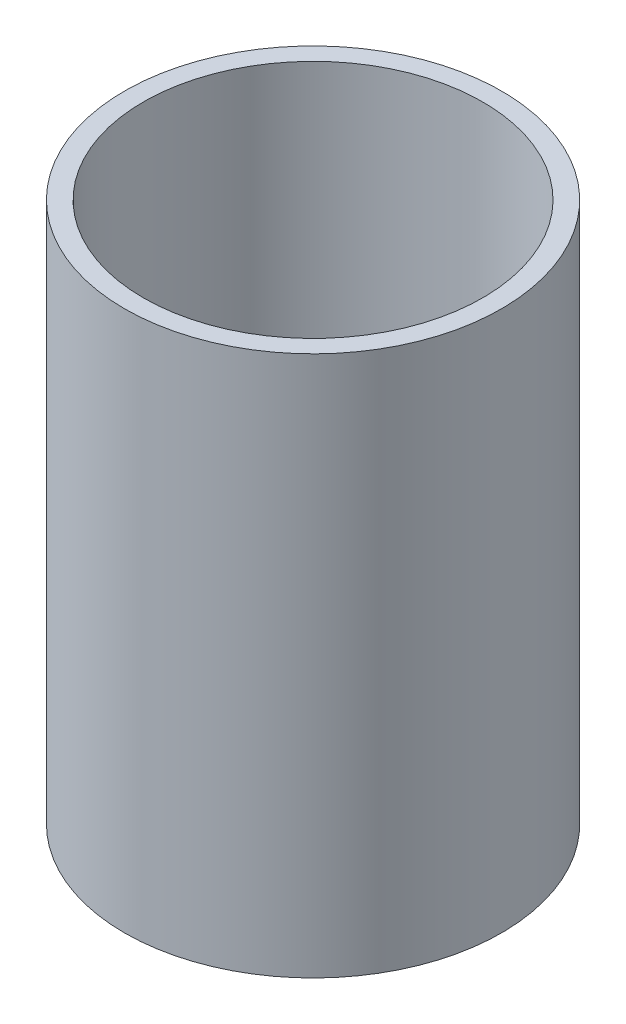
ISO-10303-21;
HEADER;
FILE_DESCRIPTION(('STEP AP214'),'2;1');
FILE_NAME('part.step','',(''),(''),'','','');
FILE_SCHEMA(('AUTOMOTIVE_DESIGN { 1 0 10303 214 1 1 1 1 }'));
ENDSEC;
DATA;
#1=APPLICATION_CONTEXT('core data for automotive mechanical design processes');
#2=APPLICATION_PROTOCOL_DEFINITION('international standard','automotive_design',2000,#1);
#3=PRODUCT_CONTEXT('',#1,'mechanical');
#4=PRODUCT('Part','Part','',(#3));
#5=PRODUCT_RELATED_PRODUCT_CATEGORY('part','',(#4));
#6=PRODUCT_DEFINITION_FORMATION('','',#4);
#7=PRODUCT_DEFINITION_CONTEXT('part definition',#1,'design');
#8=PRODUCT_DEFINITION('design','',#6,#7);
#9=PRODUCT_DEFINITION_SHAPE('','',#8);
#10=(LENGTH_UNIT() NAMED_UNIT(*) SI_UNIT(.MILLI.,.METRE.));
#11=(NAMED_UNIT(*) PLANE_ANGLE_UNIT() SI_UNIT($,.RADIAN.));
#12=(NAMED_UNIT(*) SI_UNIT($,.STERADIAN.) SOLID_ANGLE_UNIT());
#13=UNCERTAINTY_MEASURE_WITH_UNIT(LENGTH_MEASURE(1.E-05),#10,'distance_accuracy_value','');
#14=(GEOMETRIC_REPRESENTATION_CONTEXT(3) GLOBAL_UNCERTAINTY_ASSIGNED_CONTEXT((#13)) GLOBAL_UNIT_ASSIGNED_CONTEXT((#10,
#11,#12)) REPRESENTATION_CONTEXT('',''));
#15=CARTESIAN_POINT('',(0.,0.,0.));
#16=DIRECTION('',(0.,0.,1.));
#17=DIRECTION('',(1.,0.,0.));
#18=AXIS2_PLACEMENT_3D('',#15,#16,#17);
#19=CARTESIAN_POINT('',(0.,43.,0.));
#20=DIRECTION('',(0.,1.,0.));
#21=DIRECTION('',(0.,0.,1.));
#22=AXIS2_PLACEMENT_3D('',#19,#20,#21);
#23=PLANE('',#22);
#24=CARTESIAN_POINT('',(0.,43.,0.));
#25=DIRECTION('',(0.,1.,0.));
#26=DIRECTION('',(0.,0.,1.));
#27=AXIS2_PLACEMENT_3D('',#24,#25,#26);
#28=CIRCLE('',#27,15.);
#29=CARTESIAN_POINT('',(0.,43.,15.));
#30=VERTEX_POINT('',#29);
#31=EDGE_CURVE('E10',#30,#30,#28,.T.);
#32=ORIENTED_EDGE('',*,*,#31,.T.);
#33=EDGE_LOOP('',(#32));
#34=FACE_BOUND('',#33,.T.);
#35=CARTESIAN_POINT('',(0.,43.,0.));
#36=DIRECTION('',(0.,1.,0.));
#37=DIRECTION('',(0.,0.,1.));
#38=AXIS2_PLACEMENT_3D('',#35,#36,#37);
#39=CIRCLE('',#38,13.5);
#40=CARTESIAN_POINT('',(0.,43.,13.5));
#41=VERTEX_POINT('',#40);
#42=EDGE_CURVE('E43',#41,#41,#39,.T.);
#43=ORIENTED_EDGE('',*,*,#42,.F.);
#44=EDGE_LOOP('',(#43));
#45=FACE_BOUND('',#44,.T.);
#46=ADVANCED_FACE('F32',(#34,#45),#23,.T.);
#47=CARTESIAN_POINT('',(0.,0.,0.));
#48=DIRECTION('',(0.,1.,0.));
#49=DIRECTION('',(0.,0.,1.));
#50=AXIS2_PLACEMENT_3D('',#47,#48,#49);
#51=PLANE('',#50);
#52=CARTESIAN_POINT('',(0.,0.,0.));
#53=DIRECTION('',(0.,1.,0.));
#54=DIRECTION('',(0.,0.,1.));
#55=AXIS2_PLACEMENT_3D('',#52,#53,#54);
#56=CIRCLE('',#55,15.);
#57=CARTESIAN_POINT('',(0.,0.,15.));
#58=VERTEX_POINT('',#57);
#59=EDGE_CURVE('E36',#58,#58,#56,.T.);
#60=ORIENTED_EDGE('',*,*,#59,.F.);
#61=EDGE_LOOP('',(#60));
#62=FACE_BOUND('',#61,.T.);
#63=CARTESIAN_POINT('',(0.,0.,0.));
#64=DIRECTION('',(0.,1.,0.));
#65=DIRECTION('',(0.,0.,1.));
#66=AXIS2_PLACEMENT_3D('',#63,#64,#65);
#67=CIRCLE('',#66,13.5);
#68=CARTESIAN_POINT('',(0.,0.,13.5));
#69=VERTEX_POINT('',#68);
#70=EDGE_CURVE('E45',#69,#69,#67,.T.);
#71=ORIENTED_EDGE('',*,*,#70,.T.);
#72=EDGE_LOOP('',(#71));
#73=FACE_BOUND('',#72,.T.);
#74=ADVANCED_FACE('F55',(#62,#73),#51,.F.);
#75=CARTESIAN_POINT('',(0.,43.,0.));
#76=DIRECTION('',(0.,-1.,0.));
#77=DIRECTION('',(0.,0.,-1.));
#78=AXIS2_PLACEMENT_3D('',#75,#76,#77);
#79=CYLINDRICAL_SURFACE('',#78,15.);
#80=ORIENTED_EDGE('',*,*,#31,.F.);
#81=EDGE_LOOP('',(#80));
#82=FACE_BOUND('',#81,.T.);
#83=ORIENTED_EDGE('',*,*,#59,.T.);
#84=EDGE_LOOP('',(#83));
#85=FACE_BOUND('',#84,.T.);
#86=ADVANCED_FACE('F34',(#82,#85),#79,.T.);
#87=CARTESIAN_POINT('',(0.,43.,0.));
#88=DIRECTION('',(0.,-1.,0.));
#89=DIRECTION('',(0.,0.,-1.));
#90=AXIS2_PLACEMENT_3D('',#87,#88,#89);
#91=CYLINDRICAL_SURFACE('',#90,13.5);
#92=ORIENTED_EDGE('',*,*,#42,.T.);
#93=EDGE_LOOP('',(#92));
#94=FACE_BOUND('',#93,.T.);
#95=ORIENTED_EDGE('',*,*,#70,.F.);
#96=EDGE_LOOP('',(#95));
#97=FACE_BOUND('',#96,.T.);
#98=ADVANCED_FACE('F51',(#94,#97),#91,.F.);
#99=CLOSED_SHELL('',(#46,#74,#86,#98));
#100=MANIFOLD_SOLID_BREP('B2',#99);
#101=ADVANCED_BREP_SHAPE_REPRESENTATION('',(#18,#100),#14);
#102=SHAPE_DEFINITION_REPRESENTATION(#9,#101);
ENDSEC;
END-ISO-10303-21;
